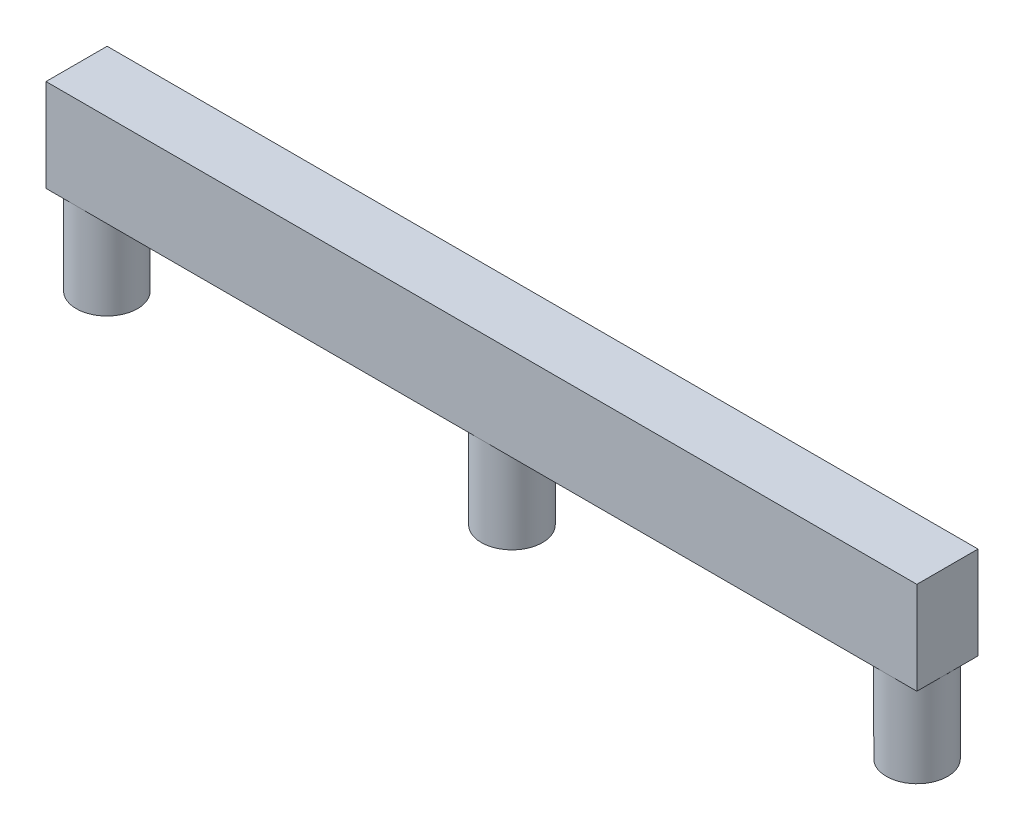
ISO-10303-21;
HEADER;
FILE_DESCRIPTION(('STEP AP214'),'2;1');
FILE_NAME('part.step','',(''),(''),'','','');
FILE_SCHEMA(('AUTOMOTIVE_DESIGN { 1 0 10303 214 1 1 1 1 }'));
ENDSEC;
DATA;
#1=APPLICATION_CONTEXT('core data for automotive mechanical design processes');
#2=APPLICATION_PROTOCOL_DEFINITION('international standard','automotive_design',2000,#1);
#3=PRODUCT_CONTEXT('',#1,'mechanical');
#4=PRODUCT('Part','Part','',(#3));
#5=PRODUCT_RELATED_PRODUCT_CATEGORY('part','',(#4));
#6=PRODUCT_DEFINITION_FORMATION('','',#4);
#7=PRODUCT_DEFINITION_CONTEXT('part definition',#1,'design');
#8=PRODUCT_DEFINITION('design','',#6,#7);
#9=PRODUCT_DEFINITION_SHAPE('','',#8);
#10=(LENGTH_UNIT() NAMED_UNIT(*) SI_UNIT(.MILLI.,.METRE.));
#11=(NAMED_UNIT(*) PLANE_ANGLE_UNIT() SI_UNIT($,.RADIAN.));
#12=(NAMED_UNIT(*) SI_UNIT($,.STERADIAN.) SOLID_ANGLE_UNIT());
#13=UNCERTAINTY_MEASURE_WITH_UNIT(LENGTH_MEASURE(1.E-05),#10,'distance_accuracy_value','');
#14=(GEOMETRIC_REPRESENTATION_CONTEXT(3) GLOBAL_UNCERTAINTY_ASSIGNED_CONTEXT((#13)) GLOBAL_UNIT_ASSIGNED_CONTEXT((#10,
#11,#12)) REPRESENTATION_CONTEXT('',''));
#15=CARTESIAN_POINT('',(0.,0.,0.));
#16=DIRECTION('',(0.,0.,1.));
#17=DIRECTION('',(1.,0.,0.));
#18=AXIS2_PLACEMENT_3D('',#15,#16,#17);
#19=CARTESIAN_POINT('',(0.,5.,0.));
#20=DIRECTION('',(0.,-1.,0.));
#21=DIRECTION('',(0.,0.,-1.));
#22=AXIS2_PLACEMENT_3D('',#19,#20,#21);
#23=PLANE('',#22);
#24=DIRECTION('',(-1.,0.,0.));
#25=VECTOR('',#24,1.);
#26=CARTESIAN_POINT('',(-24.4524438593188,5.,-1.71498729643853));
#27=LINE('',#26,#25);
#28=CARTESIAN_POINT('',(-22.8812195604872,5.,-1.71498729643853));
#29=VERTEX_POINT('',#28);
#30=CARTESIAN_POINT('',(-24.4524438593188,5.,-1.71498729643853));
#31=VERTEX_POINT('',#30);
#32=EDGE_CURVE('E184',#29,#31,#27,.T.);
#33=ORIENTED_EDGE('',*,*,#32,.F.);
#34=CARTESIAN_POINT('',(-22.75,5.,0.));
#35=DIRECTION('',(0.,-1.,0.));
#36=DIRECTION('',(0.,0.,-1.));
#37=AXIS2_PLACEMENT_3D('',#34,#35,#36);
#38=CIRCLE('',#37,1.72);
#39=CARTESIAN_POINT('',(-24.4524438593188,5.,-0.245122226384759));
#40=VERTEX_POINT('',#39);
#41=EDGE_CURVE('E11',#29,#40,#38,.F.);
#42=ORIENTED_EDGE('',*,*,#41,.T.);
#43=DIRECTION('',(0.,0.,1.));
#44=VECTOR('',#43,1.);
#45=CARTESIAN_POINT('',(-24.4524438593188,5.,1.71832179147735));
#46=LINE('',#45,#44);
#47=EDGE_CURVE('E217',#31,#40,#46,.T.);
#48=ORIENTED_EDGE('',*,*,#47,.F.);
#49=EDGE_LOOP('',(#33,#42,#48));
#50=FACE_BOUND('',#49,.T.);
#51=ADVANCED_FACE('F35',(#50),#23,.T.);
#52=CARTESIAN_POINT('',(-24.4524438593188,5.,0.245122226384759));
#53=VERTEX_POINT('',#52);
#54=CARTESIAN_POINT('',(-24.4524438593188,5.,1.71832179147735));
#55=VERTEX_POINT('',#54);
#56=EDGE_CURVE('E281',#53,#55,#46,.T.);
#57=ORIENTED_EDGE('',*,*,#56,.F.);
#58=CARTESIAN_POINT('',(-22.8259619703145,5.,1.71832179147735));
#59=VERTEX_POINT('',#58);
#60=EDGE_CURVE('E40',#53,#59,#38,.F.);
#61=ORIENTED_EDGE('',*,*,#60,.T.);
#62=DIRECTION('',(1.,0.,0.));
#63=VECTOR('',#62,1.);
#64=CARTESIAN_POINT('',(-24.4524438593188,5.,1.71832179147735));
#65=LINE('',#64,#63);
#66=EDGE_CURVE('E153',#55,#59,#65,.T.);
#67=ORIENTED_EDGE('',*,*,#66,.F.);
#68=EDGE_LOOP('',(#57,#61,#67));
#69=FACE_BOUND('',#68,.T.);
#70=ADVANCED_FACE('F338',(#69),#23,.T.);
#71=CARTESIAN_POINT('',(22.6187804395128,5.,-1.71498729643853));
#72=VERTEX_POINT('',#71);
#73=CARTESIAN_POINT('',(0.131219560487203,5.,-1.71498729643853));
#74=VERTEX_POINT('',#73);
#75=EDGE_CURVE('E208',#72,#74,#27,.T.);
#76=ORIENTED_EDGE('',*,*,#75,.F.);
#77=CARTESIAN_POINT('',(22.75,5.,0.));
#78=DIRECTION('',(0.,1.,0.));
#79=DIRECTION('',(0.,0.,1.));
#80=AXIS2_PLACEMENT_3D('',#77,#78,#79);
#81=CIRCLE('',#80,1.72);
#82=CARTESIAN_POINT('',(22.6740380296855,5.,1.71832179147735));
#83=VERTEX_POINT('',#82);
#84=EDGE_CURVE('E62',#72,#83,#81,.T.);
#85=ORIENTED_EDGE('',*,*,#84,.T.);
#86=CARTESIAN_POINT('',(0.0759619703144844,5.,1.71832179147735));
#87=VERTEX_POINT('',#86);
#88=EDGE_CURVE('E146',#87,#83,#65,.T.);
#89=ORIENTED_EDGE('',*,*,#88,.F.);
#90=CARTESIAN_POINT('',(0.,5.,0.));
#91=DIRECTION('',(0.,1.,0.));
#92=DIRECTION('',(0.,0.,1.));
#93=AXIS2_PLACEMENT_3D('',#90,#91,#92);
#94=CIRCLE('',#93,1.72);
#95=EDGE_CURVE('E397',#87,#74,#94,.T.);
#96=ORIENTED_EDGE('',*,*,#95,.T.);
#97=EDGE_LOOP('',(#76,#85,#89,#96));
#98=FACE_BOUND('',#97,.T.);
#99=ADVANCED_FACE('F343',(#98),#23,.T.);
#100=CARTESIAN_POINT('',(22.8259619703145,5.,1.71832179147735));
#101=VERTEX_POINT('',#100);
#102=CARTESIAN_POINT('',(24.4601845809133,5.,1.71832179147735));
#103=VERTEX_POINT('',#102);
#104=EDGE_CURVE('E215',#101,#103,#65,.T.);
#105=ORIENTED_EDGE('',*,*,#104,.F.);
#106=CARTESIAN_POINT('',(24.4601845809133,5.,0.183490324558189));
#107=VERTEX_POINT('',#106);
#108=EDGE_CURVE('E286',#101,#107,#81,.T.);
#109=ORIENTED_EDGE('',*,*,#108,.T.);
#110=DIRECTION('',(0.,0.,-1.));
#111=VECTOR('',#110,1.);
#112=CARTESIAN_POINT('',(24.4601845809133,5.,1.71832179147735));
#113=LINE('',#112,#111);
#114=EDGE_CURVE('E191',#103,#107,#113,.T.);
#115=ORIENTED_EDGE('',*,*,#114,.F.);
#116=EDGE_LOOP('',(#105,#109,#115));
#117=FACE_BOUND('',#116,.T.);
#118=ADVANCED_FACE('F348',(#117),#23,.T.);
#119=CARTESIAN_POINT('',(0.,5.,0.));
#120=DIRECTION('',(0.,-1.,0.));
#121=DIRECTION('',(0.,0.,-1.));
#122=AXIS2_PLACEMENT_3D('',#119,#120,#121);
#123=CYLINDRICAL_SURFACE('',#122,1.72);
#124=ORIENTED_EDGE('',*,*,#95,.F.);
#125=CARTESIAN_POINT('',(-0.0759619703144844,5.,1.71832179147735));
#126=DIRECTION('',(1.,0.,0.));
#127=VECTOR('',#126,1.);
#128=LINE('',#125,#127);
#129=CARTESIAN_POINT('',(-0.0759619703144856,5.,1.71832179147735));
#130=VERTEX_POINT('',#129);
#131=EDGE_CURVE('E399',#130,#87,#128,.T.);
#132=ORIENTED_EDGE('',*,*,#131,.F.);
#133=CARTESIAN_POINT('',(-0.131219560487203,5.,-1.71498729643853));
#134=VERTEX_POINT('',#133);
#135=EDGE_CURVE('E142',#134,#130,#94,.T.);
#136=ORIENTED_EDGE('',*,*,#135,.F.);
#137=CARTESIAN_POINT('',(0.131219560487204,5.,-1.71498729643853));
#138=DIRECTION('',(-1.,0.,0.));
#139=VECTOR('',#138,1.);
#140=LINE('',#137,#139);
#141=EDGE_CURVE('E231',#74,#134,#140,.T.);
#142=ORIENTED_EDGE('',*,*,#141,.F.);
#143=EDGE_LOOP('',(#124,#132,#136,#142));
#144=FACE_BOUND('',#143,.T.);
#145=CARTESIAN_POINT('',(0.,0.,0.));
#146=DIRECTION('',(0.,1.,0.));
#147=DIRECTION('',(0.,0.,1.));
#148=AXIS2_PLACEMENT_3D('',#145,#146,#147);
#149=CIRCLE('',#148,1.72);
#150=CARTESIAN_POINT('',(0.,0.,1.72));
#151=VERTEX_POINT('',#150);
#152=EDGE_CURVE('E402',#151,#151,#149,.T.);
#153=ORIENTED_EDGE('',*,*,#152,.T.);
#154=EDGE_LOOP('',(#153));
#155=FACE_BOUND('',#154,.T.);
#156=ADVANCED_FACE('F37',(#144,#155),#123,.T.);
#157=CARTESIAN_POINT('',(0.,0.,0.));
#158=DIRECTION('',(0.,1.,0.));
#159=DIRECTION('',(0.,0.,1.));
#160=AXIS2_PLACEMENT_3D('',#157,#158,#159);
#161=PLANE('',#160);
#162=ORIENTED_EDGE('',*,*,#152,.F.);
#163=EDGE_LOOP('',(#162));
#164=FACE_BOUND('',#163,.T.);
#165=ADVANCED_FACE('F421',(#164),#161,.F.);
#166=CARTESIAN_POINT('',(24.4601845809133,5.,-0.183490324558189));
#167=VERTEX_POINT('',#166);
#168=CARTESIAN_POINT('',(24.4601845809133,5.,-1.71498729643853));
#169=VERTEX_POINT('',#168);
#170=EDGE_CURVE('E388',#167,#169,#113,.T.);
#171=ORIENTED_EDGE('',*,*,#170,.F.);
#172=CARTESIAN_POINT('',(22.8812195604872,5.,-1.71498729643853));
#173=VERTEX_POINT('',#172);
#174=EDGE_CURVE('E296',#167,#173,#81,.T.);
#175=ORIENTED_EDGE('',*,*,#174,.T.);
#176=EDGE_CURVE('E201',#169,#173,#27,.T.);
#177=ORIENTED_EDGE('',*,*,#176,.F.);
#178=EDGE_LOOP('',(#171,#175,#177));
#179=FACE_BOUND('',#178,.T.);
#180=ADVANCED_FACE('F336',(#179),#23,.T.);
#181=CARTESIAN_POINT('',(-24.4524438593188,10.2,1.71832179147735));
#182=DIRECTION('',(1.,0.,0.));
#183=DIRECTION('',(0.,0.,-1.));
#184=AXIS2_PLACEMENT_3D('',#181,#182,#183);
#185=PLANE('',#184);
#186=ORIENTED_EDGE('',*,*,#47,.T.);
#187=EDGE_CURVE('E280',#40,#53,#46,.T.);
#188=ORIENTED_EDGE('',*,*,#187,.T.);
#189=ORIENTED_EDGE('',*,*,#56,.T.);
#190=DIRECTION('',(0.,-1.,0.));
#191=VECTOR('',#190,1.);
#192=CARTESIAN_POINT('',(-24.4524438593188,10.2,1.71832179147735));
#193=LINE('',#192,#191);
#194=CARTESIAN_POINT('',(-24.4524438593188,10.2,1.71832179147735));
#195=VERTEX_POINT('',#194);
#196=EDGE_CURVE('E416',#195,#55,#193,.T.);
#197=ORIENTED_EDGE('',*,*,#196,.F.);
#198=DIRECTION('',(0.,0.,1.));
#199=VECTOR('',#198,1.);
#200=CARTESIAN_POINT('',(-24.4524438593188,10.2,1.71832179147735));
#201=LINE('',#200,#199);
#202=CARTESIAN_POINT('',(-24.4524438593188,10.2,-1.71498729643853));
#203=VERTEX_POINT('',#202);
#204=EDGE_CURVE('E277',#203,#195,#201,.T.);
#205=ORIENTED_EDGE('',*,*,#204,.F.);
#206=DIRECTION('',(0.,-1.,0.));
#207=VECTOR('',#206,1.);
#208=CARTESIAN_POINT('',(-24.4524438593188,10.2,-1.71498729643853));
#209=LINE('',#208,#207);
#210=EDGE_CURVE('E196',#203,#31,#209,.T.);
#211=ORIENTED_EDGE('',*,*,#210,.T.);
#212=EDGE_LOOP('',(#186,#188,#189,#197,#205,#211));
#213=FACE_BOUND('',#212,.T.);
#214=ADVANCED_FACE('F168',(#213),#185,.F.);
#215=CARTESIAN_POINT('',(-24.4524438593188,10.2,1.71832179147735));
#216=DIRECTION('',(0.,0.,-1.));
#217=DIRECTION('',(-1.,0.,0.));
#218=AXIS2_PLACEMENT_3D('',#215,#216,#217);
#219=PLANE('',#218);
#220=ORIENTED_EDGE('',*,*,#66,.T.);
#221=CARTESIAN_POINT('',(-22.8259619703145,5.,1.71832179147735));
#222=DIRECTION('',(1.,0.,0.));
#223=VECTOR('',#222,1.);
#224=LINE('',#221,#223);
#225=CARTESIAN_POINT('',(-22.6740380296855,5.,1.71832179147735));
#226=VERTEX_POINT('',#225);
#227=EDGE_CURVE('E130',#59,#226,#224,.T.);
#228=ORIENTED_EDGE('',*,*,#227,.T.);
#229=EDGE_CURVE('E140',#226,#130,#65,.T.);
#230=ORIENTED_EDGE('',*,*,#229,.T.);
#231=ORIENTED_EDGE('',*,*,#131,.T.);
#232=ORIENTED_EDGE('',*,*,#88,.T.);
#233=CARTESIAN_POINT('',(22.6740380296855,5.,1.71832179147735));
#234=DIRECTION('',(1.,0.,0.));
#235=VECTOR('',#234,1.);
#236=LINE('',#233,#235);
#237=EDGE_CURVE('E282',#83,#101,#236,.T.);
#238=ORIENTED_EDGE('',*,*,#237,.T.);
#239=ORIENTED_EDGE('',*,*,#104,.T.);
#240=DIRECTION('',(0.,-1.,0.));
#241=VECTOR('',#240,1.);
#242=CARTESIAN_POINT('',(24.4601845809133,10.2,1.71832179147735));
#243=LINE('',#242,#241);
#244=CARTESIAN_POINT('',(24.4601845809133,10.2,1.71832179147735));
#245=VERTEX_POINT('',#244);
#246=EDGE_CURVE('E387',#245,#103,#243,.T.);
#247=ORIENTED_EDGE('',*,*,#246,.F.);
#248=DIRECTION('',(1.,0.,0.));
#249=VECTOR('',#248,1.);
#250=CARTESIAN_POINT('',(-24.4524438593188,10.2,1.71832179147735));
#251=LINE('',#250,#249);
#252=EDGE_CURVE('E393',#195,#245,#251,.T.);
#253=ORIENTED_EDGE('',*,*,#252,.F.);
#254=ORIENTED_EDGE('',*,*,#196,.T.);
#255=EDGE_LOOP('',(#220,#228,#230,#231,#232,#238,#239,#247,#253,#254));
#256=FACE_BOUND('',#255,.T.);
#257=ADVANCED_FACE('F150',(#256),#219,.F.);
#258=CARTESIAN_POINT('',(24.4601845809133,10.2,1.71832179147735));
#259=DIRECTION('',(-1.,0.,0.));
#260=DIRECTION('',(0.,0.,1.));
#261=AXIS2_PLACEMENT_3D('',#258,#259,#260);
#262=PLANE('',#261);
#263=ORIENTED_EDGE('',*,*,#114,.T.);
#264=DIRECTION('',(0.,0.,-1.));
#265=VECTOR('',#264,1.);
#266=CARTESIAN_POINT('',(24.4601845809133,5.,1.71832179147735));
#267=LINE('',#266,#265);
#268=EDGE_CURVE('E284',#107,#167,#267,.T.);
#269=ORIENTED_EDGE('',*,*,#268,.T.);
#270=ORIENTED_EDGE('',*,*,#170,.T.);
#271=DIRECTION('',(0.,-1.,0.));
#272=VECTOR('',#271,1.);
#273=CARTESIAN_POINT('',(24.4601845809133,10.2,-1.71498729643853));
#274=LINE('',#273,#272);
#275=CARTESIAN_POINT('',(24.4601845809133,10.2,-1.71498729643853));
#276=VERTEX_POINT('',#275);
#277=EDGE_CURVE('E278',#276,#169,#274,.T.);
#278=ORIENTED_EDGE('',*,*,#277,.F.);
#279=DIRECTION('',(0.,0.,-1.));
#280=VECTOR('',#279,1.);
#281=CARTESIAN_POINT('',(24.4601845809133,10.2,1.71832179147735));
#282=LINE('',#281,#280);
#283=EDGE_CURVE('E541',#245,#276,#282,.T.);
#284=ORIENTED_EDGE('',*,*,#283,.F.);
#285=ORIENTED_EDGE('',*,*,#246,.T.);
#286=EDGE_LOOP('',(#263,#269,#270,#278,#284,#285));
#287=FACE_BOUND('',#286,.T.);
#288=ADVANCED_FACE('F167',(#287),#262,.F.);
#289=CARTESIAN_POINT('',(-24.4524438593188,10.2,-1.71498729643853));
#290=DIRECTION('',(0.,0.,1.));
#291=DIRECTION('',(1.,0.,0.));
#292=AXIS2_PLACEMENT_3D('',#289,#290,#291);
#293=PLANE('',#292);
#294=ORIENTED_EDGE('',*,*,#176,.T.);
#295=CARTESIAN_POINT('',(22.8812195604872,5.,-1.71498729643853));
#296=DIRECTION('',(-1.,0.,0.));
#297=VECTOR('',#296,1.);
#298=LINE('',#295,#297);
#299=EDGE_CURVE('E211',#173,#72,#298,.T.);
#300=ORIENTED_EDGE('',*,*,#299,.T.);
#301=ORIENTED_EDGE('',*,*,#75,.T.);
#302=ORIENTED_EDGE('',*,*,#141,.T.);
#303=CARTESIAN_POINT('',(-22.6187804395128,5.,-1.71498729643853));
#304=VERTEX_POINT('',#303);
#305=EDGE_CURVE('E205',#134,#304,#27,.T.);
#306=ORIENTED_EDGE('',*,*,#305,.T.);
#307=CARTESIAN_POINT('',(-22.6187804395128,5.,-1.71498729643853));
#308=DIRECTION('',(-1.,0.,0.));
#309=VECTOR('',#308,1.);
#310=LINE('',#307,#309);
#311=EDGE_CURVE('E53',#304,#29,#310,.T.);
#312=ORIENTED_EDGE('',*,*,#311,.T.);
#313=ORIENTED_EDGE('',*,*,#32,.T.);
#314=ORIENTED_EDGE('',*,*,#210,.F.);
#315=DIRECTION('',(-1.,0.,0.));
#316=VECTOR('',#315,1.);
#317=CARTESIAN_POINT('',(-24.4524438593188,10.2,-1.71498729643853));
#318=LINE('',#317,#316);
#319=EDGE_CURVE('E279',#276,#203,#318,.T.);
#320=ORIENTED_EDGE('',*,*,#319,.F.);
#321=ORIENTED_EDGE('',*,*,#277,.T.);
#322=EDGE_LOOP('',(#294,#300,#301,#302,#306,#312,#313,#314,#320,#321));
#323=FACE_BOUND('',#322,.T.);
#324=ADVANCED_FACE('F234',(#323),#293,.F.);
#325=CARTESIAN_POINT('',(0.,10.2,0.));
#326=DIRECTION('',(0.,-1.,0.));
#327=DIRECTION('',(0.,0.,-1.));
#328=AXIS2_PLACEMENT_3D('',#325,#326,#327);
#329=PLANE('',#328);
#330=ORIENTED_EDGE('',*,*,#204,.T.);
#331=ORIENTED_EDGE('',*,*,#252,.T.);
#332=ORIENTED_EDGE('',*,*,#283,.T.);
#333=ORIENTED_EDGE('',*,*,#319,.T.);
#334=EDGE_LOOP('',(#330,#331,#332,#333));
#335=FACE_BOUND('',#334,.T.);
#336=ADVANCED_FACE('F243',(#335),#329,.F.);
#337=ORIENTED_EDGE('',*,*,#229,.F.);
#338=CARTESIAN_POINT('',(-22.75,5.,0.));
#339=DIRECTION('',(0.,1.,0.));
#340=DIRECTION('',(0.,0.,1.));
#341=AXIS2_PLACEMENT_3D('',#338,#339,#340);
#342=CIRCLE('',#341,1.72);
#343=EDGE_CURVE('E125',#226,#304,#342,.T.);
#344=ORIENTED_EDGE('',*,*,#343,.T.);
#345=ORIENTED_EDGE('',*,*,#305,.F.);
#346=ORIENTED_EDGE('',*,*,#135,.T.);
#347=EDGE_LOOP('',(#337,#344,#345,#346));
#348=FACE_BOUND('',#347,.T.);
#349=ADVANCED_FACE('F141',(#348),#23,.T.);
#350=CARTESIAN_POINT('',(22.75,5.,0.));
#351=DIRECTION('',(0.,1.,0.));
#352=DIRECTION('',(0.,0.,1.));
#353=AXIS2_PLACEMENT_3D('',#350,#351,#352);
#354=PLANE('',#353);
#355=ORIENTED_EDGE('',*,*,#268,.F.);
#356=EDGE_CURVE('E291',#107,#167,#81,.T.);
#357=ORIENTED_EDGE('',*,*,#356,.T.);
#358=EDGE_LOOP('',(#355,#357));
#359=FACE_BOUND('',#358,.T.);
#360=ADVANCED_FACE('F328',(#359),#354,.T.);
#361=CARTESIAN_POINT('',(22.75,5.,0.));
#362=DIRECTION('',(0.,-1.,0.));
#363=DIRECTION('',(0.,0.,-1.));
#364=AXIS2_PLACEMENT_3D('',#361,#362,#363);
#365=CYLINDRICAL_SURFACE('',#364,1.72);
#366=ORIENTED_EDGE('',*,*,#108,.F.);
#367=ORIENTED_EDGE('',*,*,#237,.F.);
#368=ORIENTED_EDGE('',*,*,#84,.F.);
#369=ORIENTED_EDGE('',*,*,#299,.F.);
#370=ORIENTED_EDGE('',*,*,#174,.F.);
#371=ORIENTED_EDGE('',*,*,#356,.F.);
#372=EDGE_LOOP('',(#366,#367,#368,#369,#370,#371));
#373=FACE_BOUND('',#372,.T.);
#374=CARTESIAN_POINT('',(22.75,0.,0.));
#375=DIRECTION('',(0.,1.,0.));
#376=DIRECTION('',(0.,0.,1.));
#377=AXIS2_PLACEMENT_3D('',#374,#375,#376);
#378=CIRCLE('',#377,1.72);
#379=CARTESIAN_POINT('',(22.75,0.,1.72));
#380=VERTEX_POINT('',#379);
#381=EDGE_CURVE('E136',#380,#380,#378,.T.);
#382=ORIENTED_EDGE('',*,*,#381,.T.);
#383=EDGE_LOOP('',(#382));
#384=FACE_BOUND('',#383,.T.);
#385=ADVANCED_FACE('F318',(#373,#384),#365,.T.);
#386=CARTESIAN_POINT('',(22.75,0.,0.));
#387=DIRECTION('',(0.,1.,0.));
#388=DIRECTION('',(0.,0.,1.));
#389=AXIS2_PLACEMENT_3D('',#386,#387,#388);
#390=PLANE('',#389);
#391=ORIENTED_EDGE('',*,*,#381,.F.);
#392=EDGE_LOOP('',(#391));
#393=FACE_BOUND('',#392,.T.);
#394=ADVANCED_FACE('F327',(#393),#390,.F.);
#395=CARTESIAN_POINT('',(-22.75,5.,0.));
#396=DIRECTION('',(0.,1.,0.));
#397=DIRECTION('',(0.,0.,1.));
#398=AXIS2_PLACEMENT_3D('',#395,#396,#397);
#399=PLANE('',#398);
#400=ORIENTED_EDGE('',*,*,#187,.F.);
#401=EDGE_CURVE('E137',#40,#53,#342,.T.);
#402=ORIENTED_EDGE('',*,*,#401,.T.);
#403=EDGE_LOOP('',(#400,#402));
#404=FACE_BOUND('',#403,.T.);
#405=ADVANCED_FACE('F353',(#404),#399,.T.);
#406=CARTESIAN_POINT('',(-22.75,5.,0.));
#407=DIRECTION('',(0.,-1.,0.));
#408=DIRECTION('',(0.,0.,-1.));
#409=AXIS2_PLACEMENT_3D('',#406,#407,#408);
#410=CYLINDRICAL_SURFACE('',#409,1.72);
#411=ORIENTED_EDGE('',*,*,#343,.F.);
#412=ORIENTED_EDGE('',*,*,#227,.F.);
#413=ORIENTED_EDGE('',*,*,#60,.F.);
#414=ORIENTED_EDGE('',*,*,#401,.F.);
#415=ORIENTED_EDGE('',*,*,#41,.F.);
#416=ORIENTED_EDGE('',*,*,#311,.F.);
#417=EDGE_LOOP('',(#411,#412,#413,#414,#415,#416));
#418=FACE_BOUND('',#417,.T.);
#419=CARTESIAN_POINT('',(-22.75,0.,0.));
#420=DIRECTION('',(0.,1.,0.));
#421=DIRECTION('',(0.,0.,1.));
#422=AXIS2_PLACEMENT_3D('',#419,#420,#421);
#423=CIRCLE('',#422,1.72);
#424=CARTESIAN_POINT('',(-22.75,0.,1.72));
#425=VERTEX_POINT('',#424);
#426=EDGE_CURVE('E354',#425,#425,#423,.T.);
#427=ORIENTED_EDGE('',*,*,#426,.T.);
#428=EDGE_LOOP('',(#427));
#429=FACE_BOUND('',#428,.T.);
#430=ADVANCED_FACE('F127',(#418,#429),#410,.T.);
#431=CARTESIAN_POINT('',(-22.75,0.,0.));
#432=DIRECTION('',(0.,1.,0.));
#433=DIRECTION('',(0.,0.,1.));
#434=AXIS2_PLACEMENT_3D('',#431,#432,#433);
#435=PLANE('',#434);
#436=ORIENTED_EDGE('',*,*,#426,.F.);
#437=EDGE_LOOP('',(#436));
#438=FACE_BOUND('',#437,.T.);
#439=ADVANCED_FACE('F370',(#438),#435,.F.);
#440=CLOSED_SHELL('',(#51,#70,#99,#118,#156,#165,#180,#214,#257,#288,#324,#336,#349,#360,#385,
#394,#405,#430,#439));
#441=MANIFOLD_SOLID_BREP('B2',#440);
#442=ADVANCED_BREP_SHAPE_REPRESENTATION('',(#18,#441),#14);
#443=SHAPE_DEFINITION_REPRESENTATION(#9,#442);
ENDSEC;
END-ISO-10303-21;
